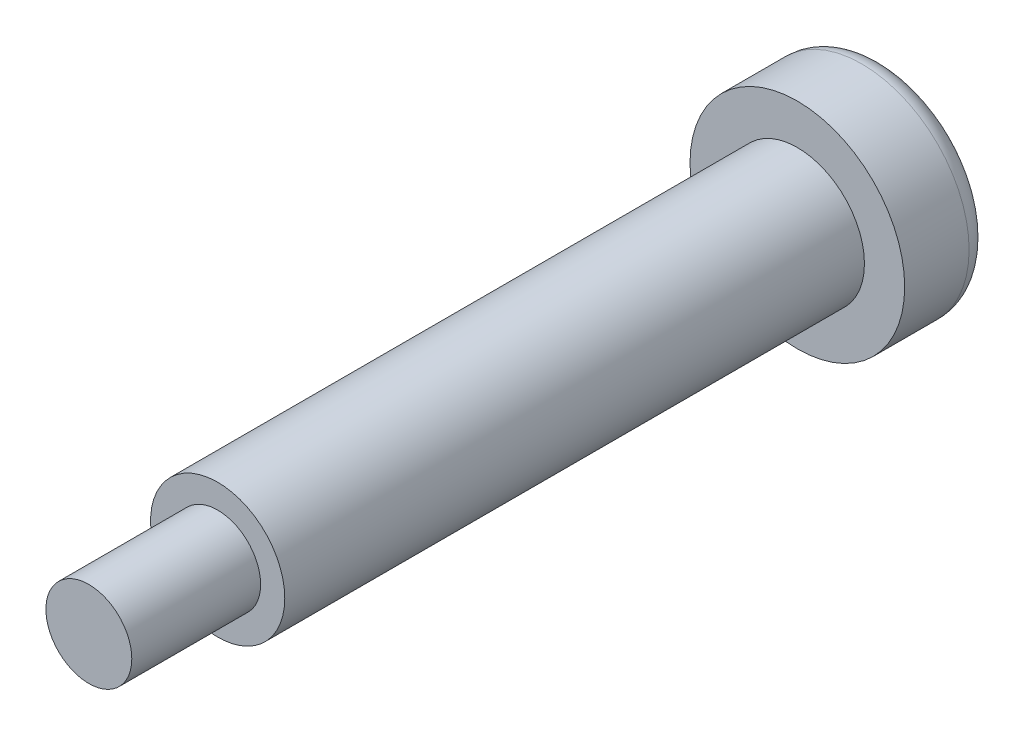
ISO-10303-21;
HEADER;
FILE_DESCRIPTION(('STEP AP214'),'2;1');
FILE_NAME('part.step','',(''),(''),'','','');
FILE_SCHEMA(('AUTOMOTIVE_DESIGN { 1 0 10303 214 1 1 1 1 }'));
ENDSEC;
DATA;
#1=APPLICATION_CONTEXT('core data for automotive mechanical design processes');
#2=APPLICATION_PROTOCOL_DEFINITION('international standard','automotive_design',2000,#1);
#3=PRODUCT_CONTEXT('',#1,'mechanical');
#4=PRODUCT('Part','Part','',(#3));
#5=PRODUCT_RELATED_PRODUCT_CATEGORY('part','',(#4));
#6=PRODUCT_DEFINITION_FORMATION('','',#4);
#7=PRODUCT_DEFINITION_CONTEXT('part definition',#1,'design');
#8=PRODUCT_DEFINITION('design','',#6,#7);
#9=PRODUCT_DEFINITION_SHAPE('','',#8);
#10=(LENGTH_UNIT() NAMED_UNIT(*) SI_UNIT(.MILLI.,.METRE.));
#11=(NAMED_UNIT(*) PLANE_ANGLE_UNIT() SI_UNIT($,.RADIAN.));
#12=(NAMED_UNIT(*) SI_UNIT($,.STERADIAN.) SOLID_ANGLE_UNIT());
#13=UNCERTAINTY_MEASURE_WITH_UNIT(LENGTH_MEASURE(1.E-05),#10,'distance_accuracy_value','');
#14=(GEOMETRIC_REPRESENTATION_CONTEXT(3) GLOBAL_UNCERTAINTY_ASSIGNED_CONTEXT((#13)) GLOBAL_UNIT_ASSIGNED_CONTEXT((#10,
#11,#12)) REPRESENTATION_CONTEXT('',''));
#15=CARTESIAN_POINT('',(0.,0.,0.));
#16=DIRECTION('',(0.,0.,1.));
#17=DIRECTION('',(1.,0.,0.));
#18=AXIS2_PLACEMENT_3D('',#15,#16,#17);
#19=CARTESIAN_POINT('',(0.,0.,2.));
#20=DIRECTION('',(0.,0.,-1.));
#21=DIRECTION('',(-1.,0.,0.));
#22=AXIS2_PLACEMENT_3D('',#19,#20,#21);
#23=CYLINDRICAL_SURFACE('',#22,5.);
#24=CARTESIAN_POINT('',(0.,0.,-1.));
#25=DIRECTION('',(0.,0.,1.));
#26=DIRECTION('',(1.,0.,0.));
#27=AXIS2_PLACEMENT_3D('',#24,#25,#26);
#28=CIRCLE('',#27,5.);
#29=CARTESIAN_POINT('',(5.,0.,-1.));
#30=VERTEX_POINT('',#29);
#31=EDGE_CURVE('E62',#30,#30,#28,.T.);
#32=ORIENTED_EDGE('',*,*,#31,.T.);
#33=EDGE_LOOP('',(#32));
#34=FACE_BOUND('',#33,.T.);
#35=CARTESIAN_POINT('',(0.,0.,2.));
#36=DIRECTION('',(0.,0.,1.));
#37=DIRECTION('',(1.,0.,0.));
#38=AXIS2_PLACEMENT_3D('',#35,#36,#37);
#39=CIRCLE('',#38,5.);
#40=CARTESIAN_POINT('',(5.,0.,2.));
#41=VERTEX_POINT('',#40);
#42=EDGE_CURVE('E190',#41,#41,#39,.T.);
#43=ORIENTED_EDGE('',*,*,#42,.F.);
#44=EDGE_LOOP('',(#43));
#45=FACE_BOUND('',#44,.T.);
#46=ADVANCED_FACE('F53',(#34,#45),#23,.T.);
#47=CARTESIAN_POINT('',(0.,0.,2.));
#48=DIRECTION('',(0.,0.,1.));
#49=DIRECTION('',(1.,0.,0.));
#50=AXIS2_PLACEMENT_3D('',#47,#48,#49);
#51=PLANE('',#50);
#52=CARTESIAN_POINT('',(0.,0.,2.));
#53=DIRECTION('',(0.,0.,1.));
#54=DIRECTION('',(1.,0.,0.));
#55=AXIS2_PLACEMENT_3D('',#52,#53,#54);
#56=CIRCLE('',#55,3.125);
#57=CARTESIAN_POINT('',(3.125,0.,2.));
#58=VERTEX_POINT('',#57);
#59=EDGE_CURVE('E186',#58,#58,#56,.T.);
#60=ORIENTED_EDGE('',*,*,#59,.F.);
#61=EDGE_LOOP('',(#60));
#62=FACE_BOUND('',#61,.T.);
#63=ORIENTED_EDGE('',*,*,#42,.T.);
#64=EDGE_LOOP('',(#63));
#65=FACE_BOUND('',#64,.T.);
#66=ADVANCED_FACE('F218',(#62,#65),#51,.T.);
#67=CARTESIAN_POINT('',(0.,0.,-2.));
#68=DIRECTION('',(0.,0.,1.));
#69=DIRECTION('',(1.,0.,0.));
#70=AXIS2_PLACEMENT_3D('',#67,#68,#69);
#71=PLANE('',#70);
#72=DIRECTION('',(0.5,0.866025403784439,0.));
#73=VECTOR('',#72,1.);
#74=CARTESIAN_POINT('',(-2.3094010767585,0.,-2.));
#75=LINE('',#74,#73);
#76=CARTESIAN_POINT('',(-2.3094010767585,0.,-2.));
#77=VERTEX_POINT('',#76);
#78=CARTESIAN_POINT('',(-1.15470053837925,2.,-2.));
#79=VERTEX_POINT('',#78);
#80=EDGE_CURVE('E149',#77,#79,#75,.T.);
#81=ORIENTED_EDGE('',*,*,#80,.F.);
#82=DIRECTION('',(-0.5,0.866025403784438,0.));
#83=VECTOR('',#82,1.);
#84=CARTESIAN_POINT('',(-1.15470053837925,-2.,-2.));
#85=LINE('',#84,#83);
#86=CARTESIAN_POINT('',(-1.15470053837925,-2.,-2.));
#87=VERTEX_POINT('',#86);
#88=EDGE_CURVE('E69',#87,#77,#85,.T.);
#89=ORIENTED_EDGE('',*,*,#88,.F.);
#90=DIRECTION('',(-1.,0.,0.));
#91=VECTOR('',#90,1.);
#92=CARTESIAN_POINT('',(1.15470053837925,-2.,-2.));
#93=LINE('',#92,#91);
#94=CARTESIAN_POINT('',(1.15470053837925,-2.,-2.));
#95=VERTEX_POINT('',#94);
#96=EDGE_CURVE('E162',#95,#87,#93,.T.);
#97=ORIENTED_EDGE('',*,*,#96,.F.);
#98=DIRECTION('',(-0.5,-0.866025403784439,0.));
#99=VECTOR('',#98,1.);
#100=CARTESIAN_POINT('',(2.3094010767585,0.,-2.));
#101=LINE('',#100,#99);
#102=CARTESIAN_POINT('',(2.3094010767585,0.,-2.));
#103=VERTEX_POINT('',#102);
#104=EDGE_CURVE('E159',#103,#95,#101,.T.);
#105=ORIENTED_EDGE('',*,*,#104,.F.);
#106=DIRECTION('',(0.5,-0.866025403784438,0.));
#107=VECTOR('',#106,1.);
#108=CARTESIAN_POINT('',(1.15470053837925,2.,-2.));
#109=LINE('',#108,#107);
#110=CARTESIAN_POINT('',(1.15470053837925,2.,-2.));
#111=VERTEX_POINT('',#110);
#112=EDGE_CURVE('E117',#111,#103,#109,.T.);
#113=ORIENTED_EDGE('',*,*,#112,.F.);
#114=DIRECTION('',(1.,0.,0.));
#115=VECTOR('',#114,1.);
#116=CARTESIAN_POINT('',(-1.15470053837925,2.,-2.));
#117=LINE('',#116,#115);
#118=EDGE_CURVE('E153',#79,#111,#117,.T.);
#119=ORIENTED_EDGE('',*,*,#118,.F.);
#120=EDGE_LOOP('',(#81,#89,#97,#105,#113,#119));
#121=FACE_BOUND('',#120,.T.);
#122=CARTESIAN_POINT('',(0.,0.,-2.));
#123=DIRECTION('',(0.,0.,1.));
#124=DIRECTION('',(1.,0.,0.));
#125=AXIS2_PLACEMENT_3D('',#122,#123,#124);
#126=CIRCLE('',#125,4.);
#127=CARTESIAN_POINT('',(4.,0.,-2.));
#128=VERTEX_POINT('',#127);
#129=EDGE_CURVE('E11',#128,#128,#126,.F.);
#130=ORIENTED_EDGE('',*,*,#129,.T.);
#131=EDGE_LOOP('',(#130));
#132=FACE_BOUND('',#131,.T.);
#133=ADVANCED_FACE('F223',(#121,#132),#71,.F.);
#134=CARTESIAN_POINT('',(0.,0.,29.));
#135=DIRECTION('',(0.,0.,-1.));
#136=DIRECTION('',(-1.,0.,0.));
#137=AXIS2_PLACEMENT_3D('',#134,#135,#136);
#138=CYLINDRICAL_SURFACE('',#137,3.125);
#139=CARTESIAN_POINT('',(0.,0.,29.));
#140=DIRECTION('',(0.,0.,1.));
#141=DIRECTION('',(1.,0.,0.));
#142=AXIS2_PLACEMENT_3D('',#139,#140,#141);
#143=CIRCLE('',#142,3.125);
#144=CARTESIAN_POINT('',(3.125,0.,29.));
#145=VERTEX_POINT('',#144);
#146=EDGE_CURVE('E181',#145,#145,#143,.T.);
#147=ORIENTED_EDGE('',*,*,#146,.F.);
#148=EDGE_LOOP('',(#147));
#149=FACE_BOUND('',#148,.T.);
#150=ORIENTED_EDGE('',*,*,#59,.T.);
#151=EDGE_LOOP('',(#150));
#152=FACE_BOUND('',#151,.T.);
#153=ADVANCED_FACE('F227',(#149,#152),#138,.T.);
#154=CARTESIAN_POINT('',(0.,0.,29.));
#155=DIRECTION('',(0.,0.,1.));
#156=DIRECTION('',(1.,0.,0.));
#157=AXIS2_PLACEMENT_3D('',#154,#155,#156);
#158=PLANE('',#157);
#159=CARTESIAN_POINT('',(0.,0.,29.));
#160=DIRECTION('',(0.,0.,1.));
#161=DIRECTION('',(1.,0.,0.));
#162=AXIS2_PLACEMENT_3D('',#159,#160,#161);
#163=CIRCLE('',#162,2.);
#164=CARTESIAN_POINT('',(2.,0.,29.));
#165=VERTEX_POINT('',#164);
#166=EDGE_CURVE('E182',#165,#165,#163,.T.);
#167=ORIENTED_EDGE('',*,*,#166,.F.);
#168=EDGE_LOOP('',(#167));
#169=FACE_BOUND('',#168,.T.);
#170=ORIENTED_EDGE('',*,*,#146,.T.);
#171=EDGE_LOOP('',(#170));
#172=FACE_BOUND('',#171,.T.);
#173=ADVANCED_FACE('F232',(#169,#172),#158,.T.);
#174=CARTESIAN_POINT('',(0.,0.,35.));
#175=DIRECTION('',(0.,0.,-1.));
#176=DIRECTION('',(-1.,0.,0.));
#177=AXIS2_PLACEMENT_3D('',#174,#175,#176);
#178=CYLINDRICAL_SURFACE('',#177,2.);
#179=CARTESIAN_POINT('',(0.,0.,35.));
#180=DIRECTION('',(0.,0.,1.));
#181=DIRECTION('',(1.,0.,0.));
#182=AXIS2_PLACEMENT_3D('',#179,#180,#181);
#183=CIRCLE('',#182,2.);
#184=CARTESIAN_POINT('',(2.,0.,35.));
#185=VERTEX_POINT('',#184);
#186=EDGE_CURVE('E168',#185,#185,#183,.T.);
#187=ORIENTED_EDGE('',*,*,#186,.F.);
#188=EDGE_LOOP('',(#187));
#189=FACE_BOUND('',#188,.T.);
#190=ORIENTED_EDGE('',*,*,#166,.T.);
#191=EDGE_LOOP('',(#190));
#192=FACE_BOUND('',#191,.T.);
#193=ADVANCED_FACE('F214',(#189,#192),#178,.T.);
#194=CARTESIAN_POINT('',(0.,0.,35.));
#195=DIRECTION('',(0.,0.,1.));
#196=DIRECTION('',(1.,0.,0.));
#197=AXIS2_PLACEMENT_3D('',#194,#195,#196);
#198=PLANE('',#197);
#199=ORIENTED_EDGE('',*,*,#186,.T.);
#200=EDGE_LOOP('',(#199));
#201=FACE_BOUND('',#200,.T.);
#202=ADVANCED_FACE('F204',(#201),#198,.T.);
#203=CARTESIAN_POINT('',(0.,0.,-1.));
#204=DIRECTION('',(0.,0.,1.));
#205=DIRECTION('',(1.,0.,0.));
#206=AXIS2_PLACEMENT_3D('',#203,#204,#205);
#207=TOROIDAL_SURFACE('',#206,4.,1.);
#208=ORIENTED_EDGE('',*,*,#129,.F.);
#209=EDGE_LOOP('',(#208));
#210=FACE_BOUND('',#209,.T.);
#211=ORIENTED_EDGE('',*,*,#31,.F.);
#212=EDGE_LOOP('',(#211));
#213=FACE_BOUND('',#212,.T.);
#214=ADVANCED_FACE('F55',(#210,#213),#207,.T.);
#215=CARTESIAN_POINT('',(-1.15470053837925,-2.,0.5));
#216=DIRECTION('',(-0.866025403784439,-0.5,0.));
#217=DIRECTION('',(0.5,-0.866025403784439,0.));
#218=AXIS2_PLACEMENT_3D('',#215,#216,#217);
#219=PLANE('',#218);
#220=ORIENTED_EDGE('',*,*,#88,.T.);
#221=DIRECTION('',(0.,0.,-1.));
#222=VECTOR('',#221,1.);
#223=CARTESIAN_POINT('',(-2.3094010767585,0.,0.5));
#224=LINE('',#223,#222);
#225=CARTESIAN_POINT('',(-2.3094010767585,0.,0.5));
#226=VERTEX_POINT('',#225);
#227=EDGE_CURVE('E99',#226,#77,#224,.T.);
#228=ORIENTED_EDGE('',*,*,#227,.F.);
#229=DIRECTION('',(-0.5,0.866025403784438,0.));
#230=VECTOR('',#229,1.);
#231=CARTESIAN_POINT('',(-1.15470053837925,-2.,0.5));
#232=LINE('',#231,#230);
#233=CARTESIAN_POINT('',(-1.15470053837925,-2.,0.5));
#234=VERTEX_POINT('',#233);
#235=EDGE_CURVE('E165',#234,#226,#232,.T.);
#236=ORIENTED_EDGE('',*,*,#235,.F.);
#237=DIRECTION('',(0.,0.,-1.));
#238=VECTOR('',#237,1.);
#239=CARTESIAN_POINT('',(-1.15470053837925,-2.,0.5));
#240=LINE('',#239,#238);
#241=EDGE_CURVE('E77',#234,#87,#240,.T.);
#242=ORIENTED_EDGE('',*,*,#241,.T.);
#243=EDGE_LOOP('',(#220,#228,#236,#242));
#244=FACE_BOUND('',#243,.T.);
#245=ADVANCED_FACE('F203',(#244),#219,.F.);
#246=CARTESIAN_POINT('',(1.15470053837925,-2.,0.5));
#247=DIRECTION('',(0.,-1.,0.));
#248=DIRECTION('',(0.,0.,-1.));
#249=AXIS2_PLACEMENT_3D('',#246,#247,#248);
#250=PLANE('',#249);
#251=ORIENTED_EDGE('',*,*,#96,.T.);
#252=ORIENTED_EDGE('',*,*,#241,.F.);
#253=DIRECTION('',(-1.,0.,0.));
#254=VECTOR('',#253,1.);
#255=CARTESIAN_POINT('',(1.15470053837925,-2.,0.5));
#256=LINE('',#255,#254);
#257=CARTESIAN_POINT('',(1.15470053837925,-2.,0.5));
#258=VERTEX_POINT('',#257);
#259=EDGE_CURVE('E131',#258,#234,#256,.T.);
#260=ORIENTED_EDGE('',*,*,#259,.F.);
#261=DIRECTION('',(0.,0.,-1.));
#262=VECTOR('',#261,1.);
#263=CARTESIAN_POINT('',(1.15470053837925,-2.,0.5));
#264=LINE('',#263,#262);
#265=EDGE_CURVE('E122',#258,#95,#264,.T.);
#266=ORIENTED_EDGE('',*,*,#265,.T.);
#267=EDGE_LOOP('',(#251,#252,#260,#266));
#268=FACE_BOUND('',#267,.T.);
#269=ADVANCED_FACE('F211',(#268),#250,.F.);
#270=CARTESIAN_POINT('',(2.3094010767585,0.,0.5));
#271=DIRECTION('',(0.866025403784438,-0.5,0.));
#272=DIRECTION('',(0.5,0.866025403784439,0.));
#273=AXIS2_PLACEMENT_3D('',#270,#271,#272);
#274=PLANE('',#273);
#275=ORIENTED_EDGE('',*,*,#104,.T.);
#276=ORIENTED_EDGE('',*,*,#265,.F.);
#277=DIRECTION('',(-0.5,-0.866025403784439,0.));
#278=VECTOR('',#277,1.);
#279=CARTESIAN_POINT('',(2.3094010767585,0.,0.5));
#280=LINE('',#279,#278);
#281=CARTESIAN_POINT('',(2.3094010767585,0.,0.5));
#282=VERTEX_POINT('',#281);
#283=EDGE_CURVE('E126',#282,#258,#280,.T.);
#284=ORIENTED_EDGE('',*,*,#283,.F.);
#285=DIRECTION('',(0.,0.,-1.));
#286=VECTOR('',#285,1.);
#287=CARTESIAN_POINT('',(2.3094010767585,0.,0.5));
#288=LINE('',#287,#286);
#289=EDGE_CURVE('E110',#282,#103,#288,.T.);
#290=ORIENTED_EDGE('',*,*,#289,.T.);
#291=EDGE_LOOP('',(#275,#276,#284,#290));
#292=FACE_BOUND('',#291,.T.);
#293=ADVANCED_FACE('F127',(#292),#274,.F.);
#294=CARTESIAN_POINT('',(1.15470053837925,2.,0.5));
#295=DIRECTION('',(0.866025403784439,0.5,0.));
#296=DIRECTION('',(-0.5,0.866025403784439,0.));
#297=AXIS2_PLACEMENT_3D('',#294,#295,#296);
#298=PLANE('',#297);
#299=ORIENTED_EDGE('',*,*,#112,.T.);
#300=ORIENTED_EDGE('',*,*,#289,.F.);
#301=DIRECTION('',(0.5,-0.866025403784438,0.));
#302=VECTOR('',#301,1.);
#303=CARTESIAN_POINT('',(1.15470053837925,2.,0.5));
#304=LINE('',#303,#302);
#305=CARTESIAN_POINT('',(1.15470053837925,2.,0.5));
#306=VERTEX_POINT('',#305);
#307=EDGE_CURVE('E114',#306,#282,#304,.T.);
#308=ORIENTED_EDGE('',*,*,#307,.F.);
#309=DIRECTION('',(0.,0.,-1.));
#310=VECTOR('',#309,1.);
#311=CARTESIAN_POINT('',(1.15470053837925,2.,0.5));
#312=LINE('',#311,#310);
#313=EDGE_CURVE('E123',#306,#111,#312,.T.);
#314=ORIENTED_EDGE('',*,*,#313,.T.);
#315=EDGE_LOOP('',(#299,#300,#308,#314));
#316=FACE_BOUND('',#315,.T.);
#317=ADVANCED_FACE('F112',(#316),#298,.F.);
#318=CARTESIAN_POINT('',(-1.15470053837925,2.,0.5));
#319=DIRECTION('',(0.,1.,0.));
#320=DIRECTION('',(0.,0.,1.));
#321=AXIS2_PLACEMENT_3D('',#318,#319,#320);
#322=PLANE('',#321);
#323=ORIENTED_EDGE('',*,*,#118,.T.);
#324=ORIENTED_EDGE('',*,*,#313,.F.);
#325=DIRECTION('',(1.,0.,0.));
#326=VECTOR('',#325,1.);
#327=CARTESIAN_POINT('',(-1.15470053837925,2.,0.5));
#328=LINE('',#327,#326);
#329=CARTESIAN_POINT('',(-1.15470053837925,2.,0.5));
#330=VERTEX_POINT('',#329);
#331=EDGE_CURVE('E137',#330,#306,#328,.T.);
#332=ORIENTED_EDGE('',*,*,#331,.F.);
#333=DIRECTION('',(0.,0.,-1.));
#334=VECTOR('',#333,1.);
#335=CARTESIAN_POINT('',(-1.15470053837925,2.,0.5));
#336=LINE('',#335,#334);
#337=EDGE_CURVE('E173',#330,#79,#336,.T.);
#338=ORIENTED_EDGE('',*,*,#337,.T.);
#339=EDGE_LOOP('',(#323,#324,#332,#338));
#340=FACE_BOUND('',#339,.T.);
#341=ADVANCED_FACE('F243',(#340),#322,.F.);
#342=CARTESIAN_POINT('',(-2.3094010767585,0.,0.5));
#343=DIRECTION('',(-0.866025403784438,0.5,0.));
#344=DIRECTION('',(-0.5,-0.866025403784438,0.));
#345=AXIS2_PLACEMENT_3D('',#342,#343,#344);
#346=PLANE('',#345);
#347=ORIENTED_EDGE('',*,*,#80,.T.);
#348=ORIENTED_EDGE('',*,*,#337,.F.);
#349=DIRECTION('',(0.5,0.866025403784439,0.));
#350=VECTOR('',#349,1.);
#351=CARTESIAN_POINT('',(-2.3094010767585,0.,0.5));
#352=LINE('',#351,#350);
#353=EDGE_CURVE('E141',#226,#330,#352,.T.);
#354=ORIENTED_EDGE('',*,*,#353,.F.);
#355=ORIENTED_EDGE('',*,*,#227,.T.);
#356=EDGE_LOOP('',(#347,#348,#354,#355));
#357=FACE_BOUND('',#356,.T.);
#358=ADVANCED_FACE('F240',(#357),#346,.F.);
#359=CARTESIAN_POINT('',(0.,0.,0.5));
#360=DIRECTION('',(0.,0.,-1.));
#361=DIRECTION('',(-1.,0.,0.));
#362=AXIS2_PLACEMENT_3D('',#359,#360,#361);
#363=PLANE('',#362);
#364=ORIENTED_EDGE('',*,*,#235,.T.);
#365=ORIENTED_EDGE('',*,*,#353,.T.);
#366=ORIENTED_EDGE('',*,*,#331,.T.);
#367=ORIENTED_EDGE('',*,*,#307,.T.);
#368=ORIENTED_EDGE('',*,*,#283,.T.);
#369=ORIENTED_EDGE('',*,*,#259,.T.);
#370=EDGE_LOOP('',(#364,#365,#366,#367,#368,#369));
#371=FACE_BOUND('',#370,.T.);
#372=ADVANCED_FACE('F134',(#371),#363,.T.);
#373=CLOSED_SHELL('',(#46,#66,#133,#153,#173,#193,#202,#214,#245,#269,#293,#317,#341,#358,#372));
#374=MANIFOLD_SOLID_BREP('B2',#373);
#375=ADVANCED_BREP_SHAPE_REPRESENTATION('',(#18,#374),#14);
#376=SHAPE_DEFINITION_REPRESENTATION(#9,#375);
ENDSEC;
END-ISO-10303-21;
